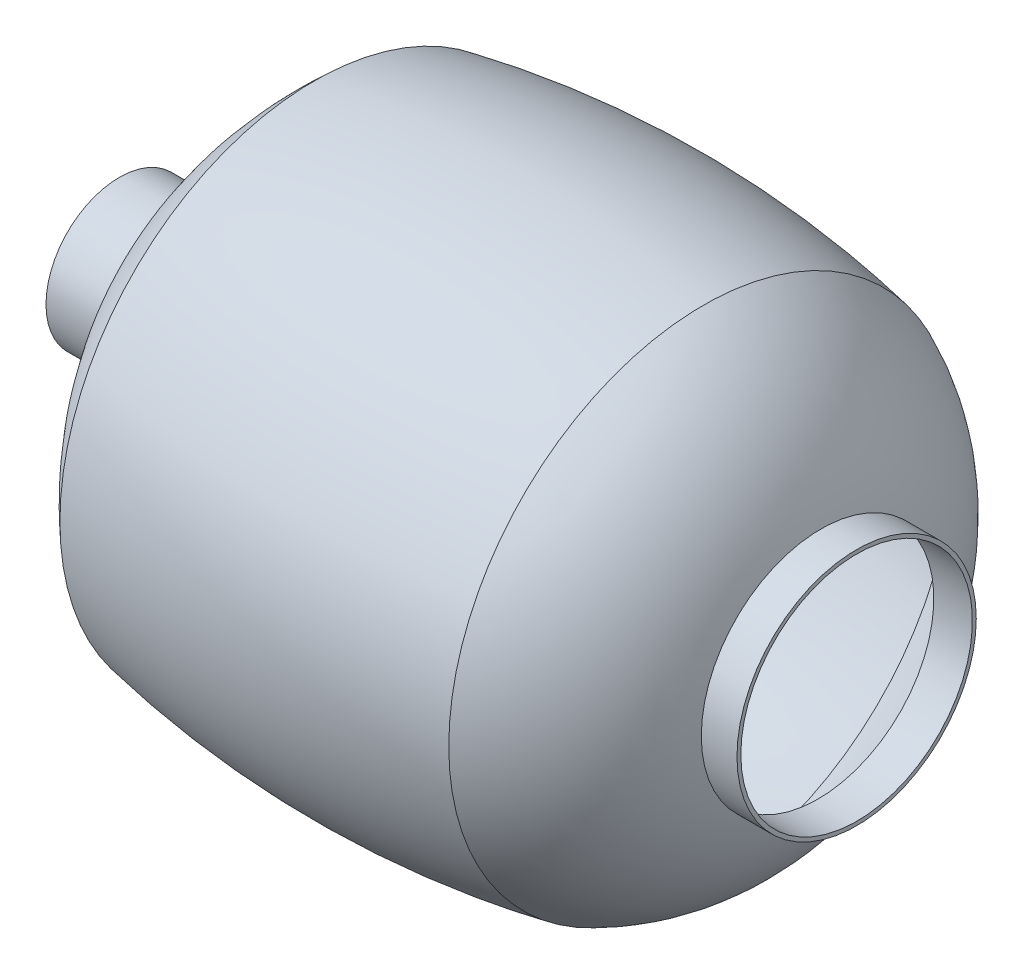
ISO-10303-21;
HEADER;
FILE_DESCRIPTION(('STEP AP214'),'2;1');
FILE_NAME('part.step','',(''),(''),'','','');
FILE_SCHEMA(('AUTOMOTIVE_DESIGN { 1 0 10303 214 1 1 1 1 }'));
ENDSEC;
DATA;
#1=APPLICATION_CONTEXT('core data for automotive mechanical design processes');
#2=APPLICATION_PROTOCOL_DEFINITION('international standard','automotive_design',2000,#1);
#3=PRODUCT_CONTEXT('',#1,'mechanical');
#4=PRODUCT('Part','Part','',(#3));
#5=PRODUCT_RELATED_PRODUCT_CATEGORY('part','',(#4));
#6=PRODUCT_DEFINITION_FORMATION('','',#4);
#7=PRODUCT_DEFINITION_CONTEXT('part definition',#1,'design');
#8=PRODUCT_DEFINITION('design','',#6,#7);
#9=PRODUCT_DEFINITION_SHAPE('','',#8);
#10=(LENGTH_UNIT() NAMED_UNIT(*) SI_UNIT(.MILLI.,.METRE.));
#11=(NAMED_UNIT(*) PLANE_ANGLE_UNIT() SI_UNIT($,.RADIAN.));
#12=(NAMED_UNIT(*) SI_UNIT($,.STERADIAN.) SOLID_ANGLE_UNIT());
#13=UNCERTAINTY_MEASURE_WITH_UNIT(LENGTH_MEASURE(1.E-05),#10,'distance_accuracy_value','');
#14=(GEOMETRIC_REPRESENTATION_CONTEXT(3) GLOBAL_UNCERTAINTY_ASSIGNED_CONTEXT((#13)) GLOBAL_UNIT_ASSIGNED_CONTEXT((#10,
#11,#12)) REPRESENTATION_CONTEXT('',''));
#15=CARTESIAN_POINT('',(0.,0.,0.));
#16=DIRECTION('',(0.,0.,1.));
#17=DIRECTION('',(1.,0.,0.));
#18=AXIS2_PLACEMENT_3D('',#15,#16,#17);
#19=CARTESIAN_POINT('',(21.1614231016504,0.,0.));
#20=DIRECTION('',(-1.,0.,0.));
#21=DIRECTION('',(0.,0.,1.));
#22=AXIS2_PLACEMENT_3D('',#19,#20,#21);
#23=DEGENERATE_TOROIDAL_SURFACE('',#22,13.4966530436066,105.951275013095,.F.);
#24=CARTESIAN_POINT('',(-80.,0.,0.));
#25=DIRECTION('',(-1.,0.,0.));
#26=DIRECTION('',(0.,0.,1.));
#27=AXIS2_PLACEMENT_3D('',#24,#25,#26);
#28=CIRCLE('',#27,18.);
#29=CARTESIAN_POINT('',(-80.,0.,18.));
#30=VERTEX_POINT('',#29);
#31=EDGE_CURVE('E71',#30,#30,#28,.T.);
#32=ORIENTED_EDGE('',*,*,#31,.T.);
#33=EDGE_LOOP('',(#32));
#34=FACE_BOUND('',#33,.T.);
#35=CARTESIAN_POINT('',(-50.,0.,0.));
#36=DIRECTION('',(-1.,0.,0.));
#37=DIRECTION('',(0.,0.,1.));
#38=AXIS2_PLACEMENT_3D('',#35,#36,#37);
#39=CIRCLE('',#38,65.);
#40=CARTESIAN_POINT('',(-50.,0.,65.));
#41=VERTEX_POINT('',#40);
#42=EDGE_CURVE('E10',#41,#41,#39,.T.);
#43=ORIENTED_EDGE('',*,*,#42,.F.);
#44=EDGE_LOOP('',(#43));
#45=FACE_BOUND('',#44,.T.);
#46=ADVANCED_FACE('F31',(#34,#45),#23,.T.);
#47=CARTESIAN_POINT('',(0.,0.,0.));
#48=DIRECTION('',(-1.,0.,0.));
#49=DIRECTION('',(0.,0.,1.));
#50=AXIS2_PLACEMENT_3D('',#47,#48,#49);
#51=DEGENERATE_TOROIDAL_SURFACE('',#50,196.316520596345,266.05699377498,.F.);
#52=ORIENTED_EDGE('',*,*,#42,.T.);
#53=EDGE_LOOP('',(#52));
#54=FACE_BOUND('',#53,.T.);
#55=CARTESIAN_POINT('',(50.,0.,0.));
#56=DIRECTION('',(-1.,0.,0.));
#57=DIRECTION('',(0.,0.,1.));
#58=AXIS2_PLACEMENT_3D('',#55,#56,#57);
#59=CIRCLE('',#58,65.);
#60=CARTESIAN_POINT('',(50.,0.,65.));
#61=VERTEX_POINT('',#60);
#62=EDGE_CURVE('E37',#61,#61,#59,.T.);
#63=ORIENTED_EDGE('',*,*,#62,.F.);
#64=EDGE_LOOP('',(#63));
#65=FACE_BOUND('',#64,.T.);
#66=ADVANCED_FACE('F89',(#54,#65),#51,.T.);
#67=CARTESIAN_POINT('',(28.3896987211177,0.,0.));
#68=DIRECTION('',(-1.,0.,0.));
#69=DIRECTION('',(0.,0.,1.));
#70=AXIS2_PLACEMENT_3D('',#67,#68,#69);
#71=DEGENERATE_TOROIDAL_SURFACE('',#70,16.119741760958,53.4442210802954,.T.);
#72=ORIENTED_EDGE('',*,*,#62,.T.);
#73=EDGE_LOOP('',(#72));
#74=FACE_BOUND('',#73,.T.);
#75=CARTESIAN_POINT('',(80.,0.,0.));
#76=DIRECTION('',(-1.,0.,0.));
#77=DIRECTION('',(0.,0.,1.));
#78=AXIS2_PLACEMENT_3D('',#75,#76,#77);
#79=CIRCLE('',#78,30.);
#80=CARTESIAN_POINT('',(80.,0.,30.));
#81=VERTEX_POINT('',#80);
#82=EDGE_CURVE('E41',#81,#81,#79,.T.);
#83=ORIENTED_EDGE('',*,*,#82,.F.);
#84=EDGE_LOOP('',(#83));
#85=FACE_BOUND('',#84,.T.);
#86=ADVANCED_FACE('F93',(#74,#85),#71,.F.);
#87=CARTESIAN_POINT('',(-101.,0.,0.));
#88=DIRECTION('',(-1.,0.,0.));
#89=DIRECTION('',(0.,0.,1.));
#90=AXIS2_PLACEMENT_3D('',#87,#88,#89);
#91=CYLINDRICAL_SURFACE('',#90,30.);
#92=ORIENTED_EDGE('',*,*,#82,.T.);
#93=EDGE_LOOP('',(#92));
#94=FACE_BOUND('',#93,.T.);
#95=CARTESIAN_POINT('',(90.,0.,0.));
#96=DIRECTION('',(-1.,0.,0.));
#97=DIRECTION('',(0.,0.,1.));
#98=AXIS2_PLACEMENT_3D('',#95,#96,#97);
#99=CIRCLE('',#98,30.);
#100=CARTESIAN_POINT('',(90.,0.,30.));
#101=VERTEX_POINT('',#100);
#102=EDGE_CURVE('E45',#101,#101,#99,.T.);
#103=ORIENTED_EDGE('',*,*,#102,.F.);
#104=EDGE_LOOP('',(#103));
#105=FACE_BOUND('',#104,.T.);
#106=ADVANCED_FACE('F97',(#94,#105),#91,.F.);
#107=CARTESIAN_POINT('',(90.,-30.,0.));
#108=DIRECTION('',(1.,0.,0.));
#109=DIRECTION('',(0.,0.,-1.));
#110=AXIS2_PLACEMENT_3D('',#107,#108,#109);
#111=PLANE('',#110);
#112=ORIENTED_EDGE('',*,*,#102,.T.);
#113=EDGE_LOOP('',(#112));
#114=FACE_BOUND('',#113,.T.);
#115=CARTESIAN_POINT('',(90.,0.,0.));
#116=DIRECTION('',(-1.,0.,0.));
#117=DIRECTION('',(0.,0.,1.));
#118=AXIS2_PLACEMENT_3D('',#115,#116,#117);
#119=CIRCLE('',#118,31.);
#120=CARTESIAN_POINT('',(90.,0.,31.));
#121=VERTEX_POINT('',#120);
#122=EDGE_CURVE('E50',#121,#121,#119,.T.);
#123=ORIENTED_EDGE('',*,*,#122,.F.);
#124=EDGE_LOOP('',(#123));
#125=FACE_BOUND('',#124,.T.);
#126=ADVANCED_FACE('F103',(#114,#125),#111,.T.);
#127=CARTESIAN_POINT('',(-101.,0.,0.));
#128=DIRECTION('',(-1.,0.,0.));
#129=DIRECTION('',(0.,0.,1.));
#130=AXIS2_PLACEMENT_3D('',#127,#128,#129);
#131=CYLINDRICAL_SURFACE('',#130,31.);
#132=ORIENTED_EDGE('',*,*,#122,.T.);
#133=EDGE_LOOP('',(#132));
#134=FACE_BOUND('',#133,.T.);
#135=CARTESIAN_POINT('',(80.7609802003741,0.,0.));
#136=DIRECTION('',(-1.,0.,0.));
#137=DIRECTION('',(0.,0.,1.));
#138=AXIS2_PLACEMENT_3D('',#135,#136,#137);
#139=CIRCLE('',#138,31.);
#140=CARTESIAN_POINT('',(80.7609802003741,0.,31.));
#141=VERTEX_POINT('',#140);
#142=EDGE_CURVE('E53',#141,#141,#139,.T.);
#143=ORIENTED_EDGE('',*,*,#142,.F.);
#144=EDGE_LOOP('',(#143));
#145=FACE_BOUND('',#144,.T.);
#146=ADVANCED_FACE('F107',(#134,#145),#131,.T.);
#147=CARTESIAN_POINT('',(28.3896987211177,0.,0.));
#148=DIRECTION('',(-1.,0.,0.));
#149=DIRECTION('',(0.,0.,1.));
#150=AXIS2_PLACEMENT_3D('',#147,#148,#149);
#151=DEGENERATE_TOROIDAL_SURFACE('',#150,16.119741760958,54.4442210802954,.T.);
#152=ORIENTED_EDGE('',*,*,#142,.T.);
#153=EDGE_LOOP('',(#152));
#154=FACE_BOUND('',#153,.T.);
#155=CARTESIAN_POINT('',(50.2995695760846,0.,0.));
#156=DIRECTION('',(-1.,0.,0.));
#157=DIRECTION('',(0.,0.,1.));
#158=AXIS2_PLACEMENT_3D('',#155,#156,#157);
#159=CIRCLE('',#158,65.9607968075635);
#160=CARTESIAN_POINT('',(50.2995695760846,0.,65.9607968075635));
#161=VERTEX_POINT('',#160);
#162=EDGE_CURVE('E56',#161,#161,#159,.T.);
#163=ORIENTED_EDGE('',*,*,#162,.F.);
#164=EDGE_LOOP('',(#163));
#165=FACE_BOUND('',#164,.T.);
#166=ADVANCED_FACE('F111',(#154,#165),#151,.T.);
#167=CARTESIAN_POINT('',(0.,0.,0.));
#168=DIRECTION('',(-1.,0.,0.));
#169=DIRECTION('',(0.,0.,1.));
#170=AXIS2_PLACEMENT_3D('',#167,#168,#169);
#171=DEGENERATE_TOROIDAL_SURFACE('',#170,196.316520596345,267.05699377498,.F.);
#172=ORIENTED_EDGE('',*,*,#162,.T.);
#173=EDGE_LOOP('',(#172));
#174=FACE_BOUND('',#173,.T.);
#175=CARTESIAN_POINT('',(-50.4631697926633,0.,0.));
#176=DIRECTION('',(-1.,0.,0.));
#177=DIRECTION('',(0.,0.,1.));
#178=AXIS2_PLACEMENT_3D('',#175,#176,#177);
#179=CIRCLE('',#178,65.9293686347481);
#180=CARTESIAN_POINT('',(-50.4631697926633,0.,65.9293686347481));
#181=VERTEX_POINT('',#180);
#182=EDGE_CURVE('E59',#181,#181,#179,.T.);
#183=ORIENTED_EDGE('',*,*,#182,.F.);
#184=EDGE_LOOP('',(#183));
#185=FACE_BOUND('',#184,.T.);
#186=ADVANCED_FACE('F115',(#174,#185),#171,.F.);
#187=CARTESIAN_POINT('',(21.1614231016504,0.,0.));
#188=DIRECTION('',(-1.,0.,0.));
#189=DIRECTION('',(0.,0.,1.));
#190=AXIS2_PLACEMENT_3D('',#187,#188,#189);
#191=DEGENERATE_TOROIDAL_SURFACE('',#190,13.4966530436066,106.951275013095,.F.);
#192=ORIENTED_EDGE('',*,*,#182,.T.);
#193=EDGE_LOOP('',(#192));
#194=FACE_BOUND('',#193,.T.);
#195=CARTESIAN_POINT('',(-80.7333400998513,0.,0.));
#196=DIRECTION('',(-1.,0.,0.));
#197=DIRECTION('',(0.,0.,1.));
#198=AXIS2_PLACEMENT_3D('',#195,#196,#197);
#199=CIRCLE('',#198,19.);
#200=CARTESIAN_POINT('',(-80.7333400998513,0.,19.));
#201=VERTEX_POINT('',#200);
#202=EDGE_CURVE('E62',#201,#201,#199,.T.);
#203=ORIENTED_EDGE('',*,*,#202,.F.);
#204=EDGE_LOOP('',(#203));
#205=FACE_BOUND('',#204,.T.);
#206=ADVANCED_FACE('F119',(#194,#205),#191,.F.);
#207=CARTESIAN_POINT('',(-101.,0.,0.));
#208=DIRECTION('',(-1.,0.,0.));
#209=DIRECTION('',(0.,0.,1.));
#210=AXIS2_PLACEMENT_3D('',#207,#208,#209);
#211=CYLINDRICAL_SURFACE('',#210,19.);
#212=ORIENTED_EDGE('',*,*,#202,.T.);
#213=EDGE_LOOP('',(#212));
#214=FACE_BOUND('',#213,.T.);
#215=CARTESIAN_POINT('',(-101.,0.,0.));
#216=DIRECTION('',(-1.,0.,0.));
#217=DIRECTION('',(0.,0.,1.));
#218=AXIS2_PLACEMENT_3D('',#215,#216,#217);
#219=CIRCLE('',#218,19.);
#220=CARTESIAN_POINT('',(-101.,0.,19.));
#221=VERTEX_POINT('',#220);
#222=EDGE_CURVE('E65',#221,#221,#219,.T.);
#223=ORIENTED_EDGE('',*,*,#222,.F.);
#224=EDGE_LOOP('',(#223));
#225=FACE_BOUND('',#224,.T.);
#226=ADVANCED_FACE('F85',(#214,#225),#211,.T.);
#227=CARTESIAN_POINT('',(-101.,-19.,0.));
#228=DIRECTION('',(-1.,0.,0.));
#229=DIRECTION('',(0.,0.,1.));
#230=AXIS2_PLACEMENT_3D('',#227,#228,#229);
#231=PLANE('',#230);
#232=ORIENTED_EDGE('',*,*,#222,.T.);
#233=EDGE_LOOP('',(#232));
#234=FACE_BOUND('',#233,.T.);
#235=CARTESIAN_POINT('',(-101.,0.,0.));
#236=DIRECTION('',(-1.,0.,0.));
#237=DIRECTION('',(0.,0.,1.));
#238=AXIS2_PLACEMENT_3D('',#235,#236,#237);
#239=CIRCLE('',#238,18.);
#240=CARTESIAN_POINT('',(-101.,0.,18.));
#241=VERTEX_POINT('',#240);
#242=EDGE_CURVE('E68',#241,#241,#239,.T.);
#243=ORIENTED_EDGE('',*,*,#242,.F.);
#244=EDGE_LOOP('',(#243));
#245=FACE_BOUND('',#244,.T.);
#246=ADVANCED_FACE('F79',(#234,#245),#231,.T.);
#247=CARTESIAN_POINT('',(-101.,0.,0.));
#248=DIRECTION('',(-1.,0.,0.));
#249=DIRECTION('',(0.,0.,1.));
#250=AXIS2_PLACEMENT_3D('',#247,#248,#249);
#251=CYLINDRICAL_SURFACE('',#250,18.);
#252=ORIENTED_EDGE('',*,*,#242,.T.);
#253=EDGE_LOOP('',(#252));
#254=FACE_BOUND('',#253,.T.);
#255=ORIENTED_EDGE('',*,*,#31,.F.);
#256=EDGE_LOOP('',(#255));
#257=FACE_BOUND('',#256,.T.);
#258=ADVANCED_FACE('F77',(#254,#257),#251,.F.);
#259=CLOSED_SHELL('',(#46,#66,#86,#106,#126,#146,#166,#186,#206,#226,#246,#258));
#260=MANIFOLD_SOLID_BREP('B2',#259);
#261=ADVANCED_BREP_SHAPE_REPRESENTATION('',(#18,#260),#14);
#262=SHAPE_DEFINITION_REPRESENTATION(#9,#261);
ENDSEC;
END-ISO-10303-21;
